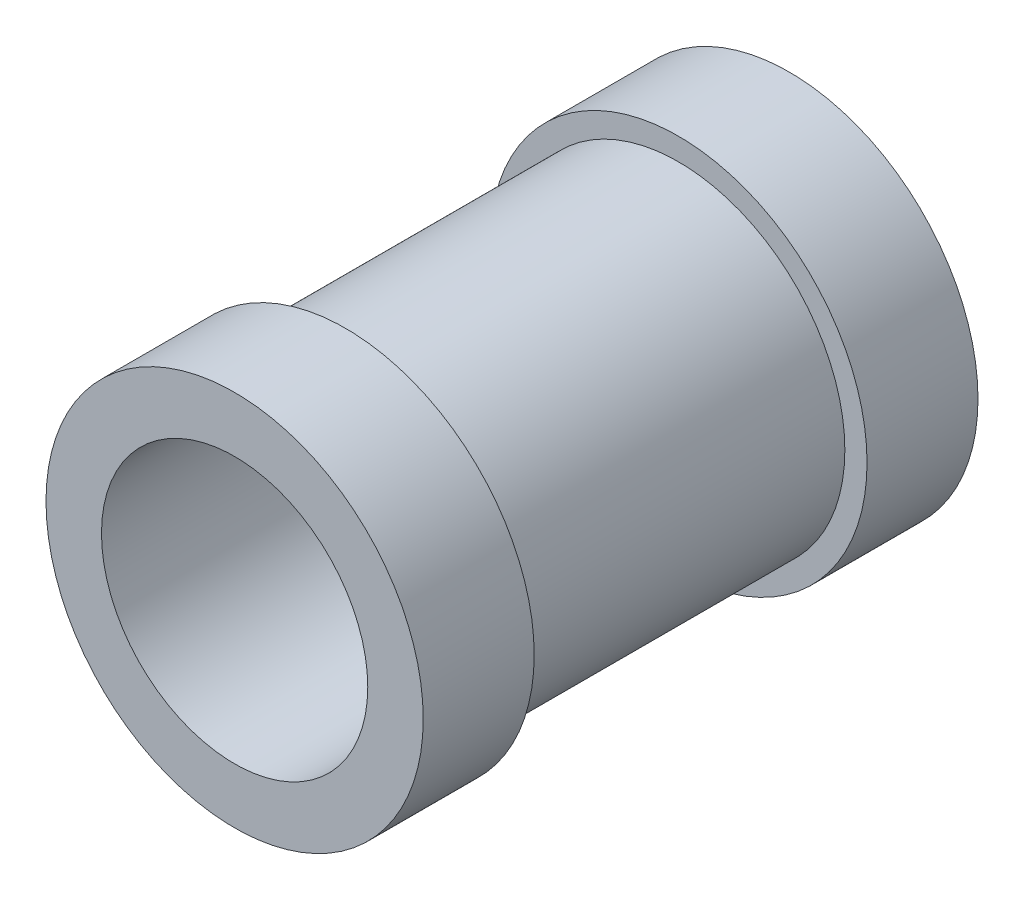
ISO-10303-21;
HEADER;
FILE_DESCRIPTION(('STEP AP214'),'2;1');
FILE_NAME('part.step','',(''),(''),'','','');
FILE_SCHEMA(('AUTOMOTIVE_DESIGN { 1 0 10303 214 1 1 1 1 }'));
ENDSEC;
DATA;
#1=APPLICATION_CONTEXT('core data for automotive mechanical design processes');
#2=APPLICATION_PROTOCOL_DEFINITION('international standard','automotive_design',2000,#1);
#3=PRODUCT_CONTEXT('',#1,'mechanical');
#4=PRODUCT('Part','Part','',(#3));
#5=PRODUCT_RELATED_PRODUCT_CATEGORY('part','',(#4));
#6=PRODUCT_DEFINITION_FORMATION('','',#4);
#7=PRODUCT_DEFINITION_CONTEXT('part definition',#1,'design');
#8=PRODUCT_DEFINITION('design','',#6,#7);
#9=PRODUCT_DEFINITION_SHAPE('','',#8);
#10=(LENGTH_UNIT() NAMED_UNIT(*) SI_UNIT(.MILLI.,.METRE.));
#11=(NAMED_UNIT(*) PLANE_ANGLE_UNIT() SI_UNIT($,.RADIAN.));
#12=(NAMED_UNIT(*) SI_UNIT($,.STERADIAN.) SOLID_ANGLE_UNIT());
#13=UNCERTAINTY_MEASURE_WITH_UNIT(LENGTH_MEASURE(1.E-05),#10,'distance_accuracy_value','');
#14=(GEOMETRIC_REPRESENTATION_CONTEXT(3) GLOBAL_UNCERTAINTY_ASSIGNED_CONTEXT((#13)) GLOBAL_UNIT_ASSIGNED_CONTEXT((#10,
#11,#12)) REPRESENTATION_CONTEXT('',''));
#15=CARTESIAN_POINT('',(0.,0.,0.));
#16=DIRECTION('',(0.,0.,1.));
#17=DIRECTION('',(1.,0.,0.));
#18=AXIS2_PLACEMENT_3D('',#15,#16,#17);
#19=CARTESIAN_POINT('',(15.,15.,5.));
#20=DIRECTION('',(0.,0.,-1.));
#21=DIRECTION('',(-1.,0.,0.));
#22=AXIS2_PLACEMENT_3D('',#19,#20,#21);
#23=CYLINDRICAL_SURFACE('',#22,1.5);
#24=CARTESIAN_POINT('',(15.,15.,4.));
#25=DIRECTION('',(0.,0.,1.));
#26=DIRECTION('',(1.,0.,0.));
#27=AXIS2_PLACEMENT_3D('',#24,#25,#26);
#28=CIRCLE('',#27,1.5);
#29=CARTESIAN_POINT('',(16.5,15.,4.));
#30=VERTEX_POINT('',#29);
#31=EDGE_CURVE('E38',#30,#30,#28,.T.);
#32=ORIENTED_EDGE('',*,*,#31,.F.);
#33=EDGE_LOOP('',(#32));
#34=FACE_BOUND('',#33,.T.);
#35=CARTESIAN_POINT('',(15.,15.,1.));
#36=DIRECTION('',(0.,0.,-1.));
#37=DIRECTION('',(-1.,0.,0.));
#38=AXIS2_PLACEMENT_3D('',#35,#36,#37);
#39=CIRCLE('',#38,1.5);
#40=CARTESIAN_POINT('',(13.5,15.,1.));
#41=VERTEX_POINT('',#40);
#42=EDGE_CURVE('E10',#41,#41,#39,.T.);
#43=ORIENTED_EDGE('',*,*,#42,.F.);
#44=EDGE_LOOP('',(#43));
#45=FACE_BOUND('',#44,.T.);
#46=ADVANCED_FACE('F31',(#34,#45),#23,.T.);
#47=CARTESIAN_POINT('',(15.,15.,5.));
#48=DIRECTION('',(0.,0.,1.));
#49=DIRECTION('',(1.,0.,0.));
#50=AXIS2_PLACEMENT_3D('',#47,#48,#49);
#51=PLANE('',#50);
#52=CARTESIAN_POINT('',(15.,15.,5.));
#53=DIRECTION('',(0.,0.,1.));
#54=DIRECTION('',(1.,0.,0.));
#55=AXIS2_PLACEMENT_3D('',#52,#53,#54);
#56=CIRCLE('',#55,1.2);
#57=CARTESIAN_POINT('',(16.2,15.,5.));
#58=VERTEX_POINT('',#57);
#59=EDGE_CURVE('E43',#58,#58,#56,.T.);
#60=ORIENTED_EDGE('',*,*,#59,.F.);
#61=EDGE_LOOP('',(#60));
#62=FACE_BOUND('',#61,.T.);
#63=CARTESIAN_POINT('',(15.,15.,5.));
#64=DIRECTION('',(0.,0.,1.));
#65=DIRECTION('',(1.,0.,0.));
#66=AXIS2_PLACEMENT_3D('',#63,#64,#65);
#67=CIRCLE('',#66,1.7);
#68=CARTESIAN_POINT('',(16.7,15.,5.));
#69=VERTEX_POINT('',#68);
#70=EDGE_CURVE('E52',#69,#69,#67,.T.);
#71=ORIENTED_EDGE('',*,*,#70,.T.);
#72=EDGE_LOOP('',(#71));
#73=FACE_BOUND('',#72,.T.);
#74=ADVANCED_FACE('F75',(#62,#73),#51,.T.);
#75=CARTESIAN_POINT('',(15.,15.,0.));
#76=DIRECTION('',(0.,0.,1.));
#77=DIRECTION('',(1.,0.,0.));
#78=AXIS2_PLACEMENT_3D('',#75,#76,#77);
#79=PLANE('',#78);
#80=CARTESIAN_POINT('',(15.,15.,0.));
#81=DIRECTION('',(0.,0.,1.));
#82=DIRECTION('',(1.,0.,0.));
#83=AXIS2_PLACEMENT_3D('',#80,#81,#82);
#84=CIRCLE('',#83,1.2);
#85=CARTESIAN_POINT('',(16.2,15.,0.));
#86=VERTEX_POINT('',#85);
#87=EDGE_CURVE('E34',#86,#86,#84,.T.);
#88=ORIENTED_EDGE('',*,*,#87,.T.);
#89=EDGE_LOOP('',(#88));
#90=FACE_BOUND('',#89,.T.);
#91=CARTESIAN_POINT('',(15.,15.,0.));
#92=DIRECTION('',(0.,0.,-1.));
#93=DIRECTION('',(-1.,0.,0.));
#94=AXIS2_PLACEMENT_3D('',#91,#92,#93);
#95=CIRCLE('',#94,1.7);
#96=CARTESIAN_POINT('',(13.3,15.,0.));
#97=VERTEX_POINT('',#96);
#98=EDGE_CURVE('E47',#97,#97,#95,.T.);
#99=ORIENTED_EDGE('',*,*,#98,.T.);
#100=EDGE_LOOP('',(#99));
#101=FACE_BOUND('',#100,.T.);
#102=ADVANCED_FACE('F61',(#90,#101),#79,.F.);
#103=CARTESIAN_POINT('',(15.,15.,5.));
#104=DIRECTION('',(0.,0.,-1.));
#105=DIRECTION('',(-1.,0.,0.));
#106=AXIS2_PLACEMENT_3D('',#103,#104,#105);
#107=CYLINDRICAL_SURFACE('',#106,1.2);
#108=ORIENTED_EDGE('',*,*,#87,.F.);
#109=EDGE_LOOP('',(#108));
#110=FACE_BOUND('',#109,.T.);
#111=ORIENTED_EDGE('',*,*,#59,.T.);
#112=EDGE_LOOP('',(#111));
#113=FACE_BOUND('',#112,.T.);
#114=ADVANCED_FACE('F64',(#110,#113),#107,.F.);
#115=CARTESIAN_POINT('',(15.,15.,4.));
#116=DIRECTION('',(0.,0.,1.));
#117=DIRECTION('',(1.,0.,0.));
#118=AXIS2_PLACEMENT_3D('',#115,#116,#117);
#119=PLANE('',#118);
#120=CARTESIAN_POINT('',(15.,15.,4.));
#121=DIRECTION('',(0.,0.,1.));
#122=DIRECTION('',(1.,0.,0.));
#123=AXIS2_PLACEMENT_3D('',#120,#121,#122);
#124=CIRCLE('',#123,1.7);
#125=CARTESIAN_POINT('',(16.7,15.,4.));
#126=VERTEX_POINT('',#125);
#127=EDGE_CURVE('E49',#126,#126,#124,.T.);
#128=ORIENTED_EDGE('',*,*,#127,.F.);
#129=EDGE_LOOP('',(#128));
#130=FACE_BOUND('',#129,.T.);
#131=ORIENTED_EDGE('',*,*,#31,.T.);
#132=EDGE_LOOP('',(#131));
#133=FACE_BOUND('',#132,.T.);
#134=ADVANCED_FACE('F66',(#130,#133),#119,.F.);
#135=CARTESIAN_POINT('',(15.,15.,4.));
#136=DIRECTION('',(0.,0.,1.));
#137=DIRECTION('',(1.,0.,0.));
#138=AXIS2_PLACEMENT_3D('',#135,#136,#137);
#139=CYLINDRICAL_SURFACE('',#138,1.7);
#140=ORIENTED_EDGE('',*,*,#127,.T.);
#141=EDGE_LOOP('',(#140));
#142=FACE_BOUND('',#141,.T.);
#143=ORIENTED_EDGE('',*,*,#70,.F.);
#144=EDGE_LOOP('',(#143));
#145=FACE_BOUND('',#144,.T.);
#146=ADVANCED_FACE('F72',(#142,#145),#139,.T.);
#147=CARTESIAN_POINT('',(15.,15.,1.));
#148=DIRECTION('',(0.,0.,-1.));
#149=DIRECTION('',(-1.,0.,0.));
#150=AXIS2_PLACEMENT_3D('',#147,#148,#149);
#151=PLANE('',#150);
#152=CARTESIAN_POINT('',(15.,15.,1.));
#153=DIRECTION('',(0.,0.,-1.));
#154=DIRECTION('',(-1.,0.,0.));
#155=AXIS2_PLACEMENT_3D('',#152,#153,#154);
#156=CIRCLE('',#155,1.7);
#157=CARTESIAN_POINT('',(13.3,15.,1.));
#158=VERTEX_POINT('',#157);
#159=EDGE_CURVE('E54',#158,#158,#156,.T.);
#160=ORIENTED_EDGE('',*,*,#159,.F.);
#161=EDGE_LOOP('',(#160));
#162=FACE_BOUND('',#161,.T.);
#163=ORIENTED_EDGE('',*,*,#42,.T.);
#164=EDGE_LOOP('',(#163));
#165=FACE_BOUND('',#164,.T.);
#166=ADVANCED_FACE('F93',(#162,#165),#151,.F.);
#167=CARTESIAN_POINT('',(15.,15.,1.));
#168=DIRECTION('',(0.,0.,-1.));
#169=DIRECTION('',(-1.,0.,0.));
#170=AXIS2_PLACEMENT_3D('',#167,#168,#169);
#171=CYLINDRICAL_SURFACE('',#170,1.7);
#172=ORIENTED_EDGE('',*,*,#159,.T.);
#173=EDGE_LOOP('',(#172));
#174=FACE_BOUND('',#173,.T.);
#175=ORIENTED_EDGE('',*,*,#98,.F.);
#176=EDGE_LOOP('',(#175));
#177=FACE_BOUND('',#176,.T.);
#178=ADVANCED_FACE('F98',(#174,#177),#171,.T.);
#179=CLOSED_SHELL('',(#46,#74,#102,#114,#134,#146,#166,#178));
#180=MANIFOLD_SOLID_BREP('B2',#179);
#181=ADVANCED_BREP_SHAPE_REPRESENTATION('',(#18,#180),#14);
#182=SHAPE_DEFINITION_REPRESENTATION(#9,#181);
ENDSEC;
END-ISO-10303-21;
